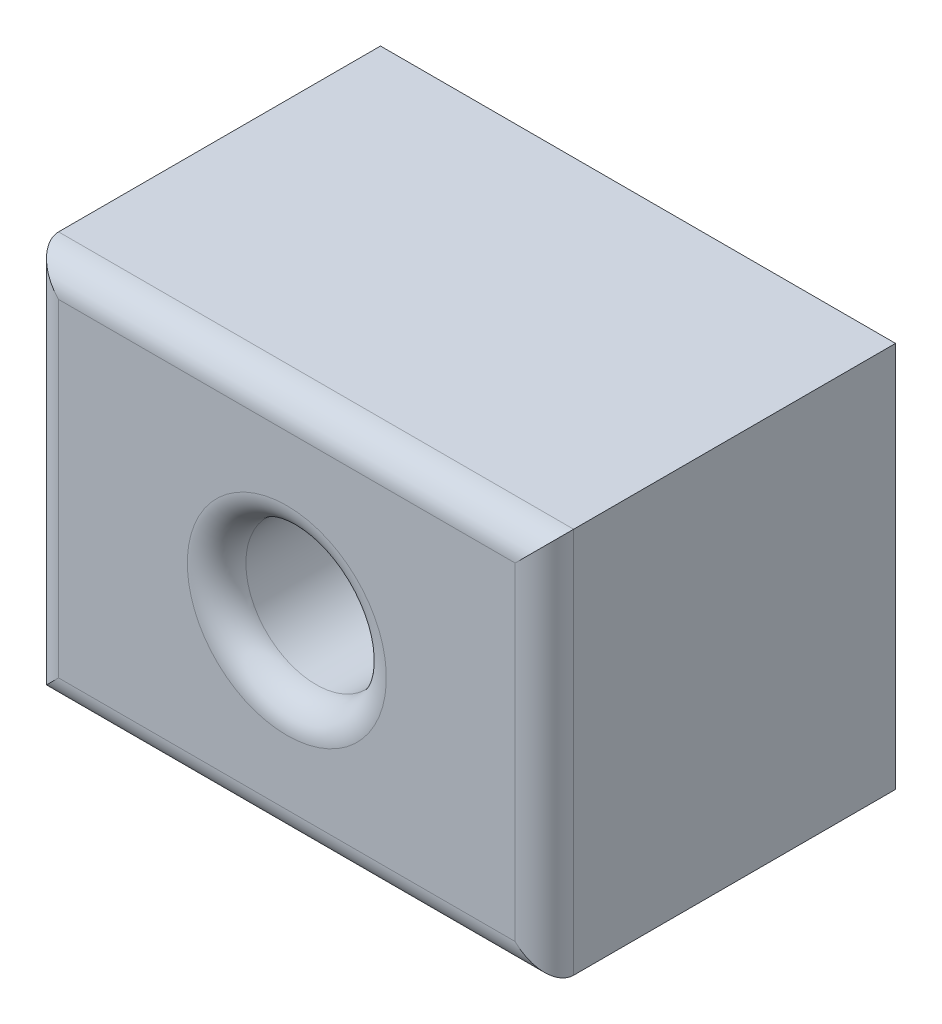
ISO-10303-21;
HEADER;
FILE_DESCRIPTION(('STEP AP214'),'2;1');
FILE_NAME('part.step','',(''),(''),'','','');
FILE_SCHEMA(('AUTOMOTIVE_DESIGN { 1 0 10303 214 1 1 1 1 }'));
ENDSEC;
DATA;
#1=APPLICATION_CONTEXT('core data for automotive mechanical design processes');
#2=APPLICATION_PROTOCOL_DEFINITION('international standard','automotive_design',2000,#1);
#3=PRODUCT_CONTEXT('',#1,'mechanical');
#4=PRODUCT('Part','Part','',(#3));
#5=PRODUCT_RELATED_PRODUCT_CATEGORY('part','',(#4));
#6=PRODUCT_DEFINITION_FORMATION('','',#4);
#7=PRODUCT_DEFINITION_CONTEXT('part definition',#1,'design');
#8=PRODUCT_DEFINITION('design','',#6,#7);
#9=PRODUCT_DEFINITION_SHAPE('','',#8);
#10=(LENGTH_UNIT() NAMED_UNIT(*) SI_UNIT(.MILLI.,.METRE.));
#11=(NAMED_UNIT(*) PLANE_ANGLE_UNIT() SI_UNIT($,.RADIAN.));
#12=(NAMED_UNIT(*) SI_UNIT($,.STERADIAN.) SOLID_ANGLE_UNIT());
#13=UNCERTAINTY_MEASURE_WITH_UNIT(LENGTH_MEASURE(1.E-05),#10,'distance_accuracy_value','');
#14=(GEOMETRIC_REPRESENTATION_CONTEXT(3) GLOBAL_UNCERTAINTY_ASSIGNED_CONTEXT((#13)) GLOBAL_UNIT_ASSIGNED_CONTEXT((#10,
#11,#12)) REPRESENTATION_CONTEXT('',''));
#15=CARTESIAN_POINT('',(0.,0.,0.));
#16=DIRECTION('',(0.,0.,1.));
#17=DIRECTION('',(1.,0.,0.));
#18=AXIS2_PLACEMENT_3D('',#15,#16,#17);
#19=CARTESIAN_POINT('',(9.57499999999997,67.085499818341,13.8275));
#20=DIRECTION('',(0.,0.,-1.));
#21=DIRECTION('',(-1.,0.,0.));
#22=AXIS2_PLACEMENT_3D('',#19,#20,#21);
#23=PLANE('',#22);
#24=CARTESIAN_POINT('',(9.57499999999997,67.085499818341,13.8275));
#25=DIRECTION('',(0.,0.,-1.));
#26=DIRECTION('',(-1.,0.,0.));
#27=AXIS2_PLACEMENT_3D('',#24,#25,#26);
#28=CIRCLE('',#27,1.47);
#29=CARTESIAN_POINT('',(8.10499999999997,67.085499818341,13.8275));
#30=VERTEX_POINT('',#29);
#31=EDGE_CURVE('E20',#30,#30,#28,.F.);
#32=ORIENTED_EDGE('',*,*,#31,.T.);
#33=EDGE_LOOP('',(#32));
#34=FACE_BOUND('',#33,.T.);
#35=CARTESIAN_POINT('',(9.57499999999997,67.085499818341,13.8275));
#36=DIRECTION('',(0.,0.,-1.));
#37=DIRECTION('',(-1.,0.,0.));
#38=AXIS2_PLACEMENT_3D('',#35,#36,#37);
#39=CIRCLE('',#38,2.695);
#40=CARTESIAN_POINT('',(6.87999999999997,67.085499818341,13.8275));
#41=VERTEX_POINT('',#40);
#42=EDGE_CURVE('E226',#41,#41,#39,.F.);
#43=ORIENTED_EDGE('',*,*,#42,.F.);
#44=EDGE_LOOP('',(#43));
#45=FACE_BOUND('',#44,.T.);
#46=ADVANCED_FACE('F17',(#34,#45),#23,.T.);
#47=CARTESIAN_POINT('',(9.57499999999997,67.085499818341,22.4025));
#48=DIRECTION('',(0.,0.,-1.));
#49=DIRECTION('',(-1.,0.,0.));
#50=AXIS2_PLACEMENT_3D('',#47,#48,#49);
#51=CYLINDRICAL_SURFACE('',#50,1.47);
#52=ORIENTED_EDGE('',*,*,#31,.F.);
#53=EDGE_LOOP('',(#52));
#54=FACE_BOUND('',#53,.T.);
#55=CARTESIAN_POINT('',(9.57499999999997,67.085499818341,15.665));
#56=DIRECTION('',(0.,0.,1.));
#57=DIRECTION('',(0.,1.,0.));
#58=AXIS2_PLACEMENT_3D('',#55,#56,#57);
#59=CIRCLE('',#58,1.47);
#60=CARTESIAN_POINT('',(9.57499999999997,68.555499818341,15.665));
#61=VERTEX_POINT('',#60);
#62=EDGE_CURVE('E223',#61,#61,#59,.F.);
#63=ORIENTED_EDGE('',*,*,#62,.F.);
#64=EDGE_LOOP('',(#63));
#65=FACE_BOUND('',#64,.T.);
#66=ADVANCED_FACE('F250',(#54,#65),#51,.F.);
#67=CARTESIAN_POINT('',(9.57499999999997,67.085499818341,16.2775));
#68=DIRECTION('',(0.,0.,-1.));
#69=DIRECTION('',(-1.,0.,0.));
#70=AXIS2_PLACEMENT_3D('',#67,#68,#69);
#71=CYLINDRICAL_SURFACE('',#70,2.695);
#72=CARTESIAN_POINT('',(9.57499999999997,67.085499818341,15.0525));
#73=DIRECTION('',(0.,0.,-1.));
#74=DIRECTION('',(-1.,0.,0.));
#75=AXIS2_PLACEMENT_3D('',#72,#73,#74);
#76=CIRCLE('',#75,2.695);
#77=CARTESIAN_POINT('',(6.87999999999997,67.085499818341,15.0525));
#78=VERTEX_POINT('',#77);
#79=EDGE_CURVE('E106',#78,#78,#76,.T.);
#80=ORIENTED_EDGE('',*,*,#79,.T.);
#81=EDGE_LOOP('',(#80));
#82=FACE_BOUND('',#81,.T.);
#83=ORIENTED_EDGE('',*,*,#42,.T.);
#84=EDGE_LOOP('',(#83));
#85=FACE_BOUND('',#84,.T.);
#86=ADVANCED_FACE('F218',(#82,#85),#71,.T.);
#87=CARTESIAN_POINT('',(9.57499999999997,67.085499818341,15.665));
#88=DIRECTION('',(0.,0.,1.));
#89=DIRECTION('',(0.,1.,0.));
#90=AXIS2_PLACEMENT_3D('',#87,#88,#89);
#91=TOROIDAL_SURFACE('',#90,2.0825,0.6125);
#92=ORIENTED_EDGE('',*,*,#62,.T.);
#93=EDGE_LOOP('',(#92));
#94=FACE_BOUND('',#93,.T.);
#95=CARTESIAN_POINT('',(9.57499999999997,67.085499818341,16.2775));
#96=DIRECTION('',(0.,0.,1.));
#97=DIRECTION('',(0.,1.,0.));
#98=AXIS2_PLACEMENT_3D('',#95,#96,#97);
#99=CIRCLE('',#98,2.08249999999999);
#100=CARTESIAN_POINT('',(9.57499999999997,69.167999818341,16.2775));
#101=VERTEX_POINT('',#100);
#102=EDGE_CURVE('E187',#101,#101,#99,.F.);
#103=ORIENTED_EDGE('',*,*,#102,.F.);
#104=EDGE_LOOP('',(#103));
#105=FACE_BOUND('',#104,.T.);
#106=ADVANCED_FACE('F212',(#94,#105),#91,.T.);
#107=CARTESIAN_POINT('',(9.57499999999997,61.376999818341,15.0525));
#108=DIRECTION('',(0.,0.,1.));
#109=DIRECTION('',(1.,0.,0.));
#110=AXIS2_PLACEMENT_3D('',#107,#108,#109);
#111=PLANE('',#110);
#112=ORIENTED_EDGE('',*,*,#79,.F.);
#113=EDGE_LOOP('',(#112));
#114=FACE_BOUND('',#113,.T.);
#115=DIRECTION('',(0.,1.,0.));
#116=VECTOR('',#115,1.);
#117=CARTESIAN_POINT('',(5.40999999999996,71.127999818341,15.0525));
#118=LINE('',#117,#116);
#119=CARTESIAN_POINT('',(5.40999999999996,64.2679998183409,15.0525));
#120=VERTEX_POINT('',#119);
#121=CARTESIAN_POINT('',(5.40999999999996,69.902999818341,15.0525));
#122=VERTEX_POINT('',#121);
#123=EDGE_CURVE('E160',#120,#122,#118,.T.);
#124=ORIENTED_EDGE('',*,*,#123,.T.);
#125=DIRECTION('',(1.,0.,0.));
#126=VECTOR('',#125,1.);
#127=CARTESIAN_POINT('',(14.965,69.902999818341,15.0525));
#128=LINE('',#127,#126);
#129=CARTESIAN_POINT('',(13.74,69.902999818341,15.0525));
#130=VERTEX_POINT('',#129);
#131=EDGE_CURVE('E178',#122,#130,#128,.T.);
#132=ORIENTED_EDGE('',*,*,#131,.T.);
#133=DIRECTION('',(0.,1.,0.));
#134=VECTOR('',#133,1.);
#135=CARTESIAN_POINT('',(13.74,63.0429998183409,15.0525));
#136=LINE('',#135,#134);
#137=CARTESIAN_POINT('',(13.74,64.2679998183409,15.0525));
#138=VERTEX_POINT('',#137);
#139=EDGE_CURVE('E173',#130,#138,#136,.F.);
#140=ORIENTED_EDGE('',*,*,#139,.T.);
#141=DIRECTION('',(1.,0.,0.));
#142=VECTOR('',#141,1.);
#143=CARTESIAN_POINT('',(4.18499999999997,64.2679998183409,15.0525));
#144=LINE('',#143,#142);
#145=EDGE_CURVE('E168',#138,#120,#144,.F.);
#146=ORIENTED_EDGE('',*,*,#145,.T.);
#147=EDGE_LOOP('',(#124,#132,#140,#146));
#148=FACE_BOUND('',#147,.T.);
#149=ADVANCED_FACE('F208',(#114,#148),#111,.F.);
#150=CARTESIAN_POINT('',(9.57499999999997,70.515499818341,15.665));
#151=DIRECTION('',(-1.,0.,0.));
#152=DIRECTION('',(0.,0.,1.));
#153=AXIS2_PLACEMENT_3D('',#150,#151,#152);
#154=CYLINDRICAL_SURFACE('',#153,0.6125);
#155=CARTESIAN_POINT('',(4.79749999999997,70.515499818341,15.665));
#156=DIRECTION('',(-0.707106781186547,-0.707106781186547,0.));
#157=DIRECTION('',(0.707106781186547,-0.707106781186547,0.));
#158=AXIS2_PLACEMENT_3D('',#155,#156,#157);
#159=ELLIPSE('',#158,0.866205806953521,0.6125);
#160=CARTESIAN_POINT('',(4.79749999999997,70.515499818341,16.2775));
#161=VERTEX_POINT('',#160);
#162=CARTESIAN_POINT('',(4.18499999999997,71.127999818341,15.665));
#163=VERTEX_POINT('',#162);
#164=EDGE_CURVE('E114',#161,#163,#159,.T.);
#165=ORIENTED_EDGE('',*,*,#164,.F.);
#166=DIRECTION('',(1.,0.,0.));
#167=VECTOR('',#166,1.);
#168=CARTESIAN_POINT('',(9.57499999999997,70.515499818341,16.2775));
#169=LINE('',#168,#167);
#170=CARTESIAN_POINT('',(14.3525,70.515499818341,16.2775));
#171=VERTEX_POINT('',#170);
#172=EDGE_CURVE('E115',#171,#161,#169,.F.);
#173=ORIENTED_EDGE('',*,*,#172,.F.);
#174=CARTESIAN_POINT('',(14.3525,70.515499818341,15.665));
#175=DIRECTION('',(-0.707106781186547,0.707106781186547,0.));
#176=DIRECTION('',(0.707106781186547,0.707106781186547,0.));
#177=AXIS2_PLACEMENT_3D('',#174,#175,#176);
#178=ELLIPSE('',#177,0.866205806953521,0.6125);
#179=CARTESIAN_POINT('',(14.965,71.127999818341,15.665));
#180=VERTEX_POINT('',#179);
#181=EDGE_CURVE('E105',#180,#171,#178,.F.);
#182=ORIENTED_EDGE('',*,*,#181,.F.);
#183=DIRECTION('',(1.,0.,0.));
#184=VECTOR('',#183,1.);
#185=CARTESIAN_POINT('',(14.965,71.127999818341,15.665));
#186=LINE('',#185,#184);
#187=EDGE_CURVE('E154',#163,#180,#186,.T.);
#188=ORIENTED_EDGE('',*,*,#187,.F.);
#189=EDGE_LOOP('',(#165,#173,#182,#188));
#190=FACE_BOUND('',#189,.T.);
#191=ADVANCED_FACE('F205',(#190),#154,.T.);
#192=CARTESIAN_POINT('',(14.3525,61.376999818341,15.665));
#193=DIRECTION('',(0.,1.,0.));
#194=DIRECTION('',(0.,0.,1.));
#195=AXIS2_PLACEMENT_3D('',#192,#193,#194);
#196=CYLINDRICAL_SURFACE('',#195,0.6125);
#197=ORIENTED_EDGE('',*,*,#181,.T.);
#198=DIRECTION('',(0.,1.,0.));
#199=VECTOR('',#198,1.);
#200=CARTESIAN_POINT('',(14.3525,61.376999818341,16.2775));
#201=LINE('',#200,#199);
#202=CARTESIAN_POINT('',(14.3525,63.6554998183409,16.2775));
#203=VERTEX_POINT('',#202);
#204=EDGE_CURVE('E110',#203,#171,#201,.T.);
#205=ORIENTED_EDGE('',*,*,#204,.F.);
#206=CARTESIAN_POINT('',(14.3525,63.6554998183409,15.665));
#207=DIRECTION('',(0.707106781186547,0.707106781186547,0.));
#208=DIRECTION('',(-0.707106781186547,0.707106781186547,0.));
#209=AXIS2_PLACEMENT_3D('',#206,#207,#208);
#210=ELLIPSE('',#209,0.866205806953521,0.6125);
#211=CARTESIAN_POINT('',(14.965,63.0429998183409,15.665));
#212=VERTEX_POINT('',#211);
#213=EDGE_CURVE('E93',#203,#212,#210,.T.);
#214=ORIENTED_EDGE('',*,*,#213,.T.);
#215=DIRECTION('',(0.,1.,0.));
#216=VECTOR('',#215,1.);
#217=CARTESIAN_POINT('',(14.965,63.0429998183409,15.665));
#218=LINE('',#217,#216);
#219=EDGE_CURVE('E123',#180,#212,#218,.F.);
#220=ORIENTED_EDGE('',*,*,#219,.F.);
#221=EDGE_LOOP('',(#197,#205,#214,#220));
#222=FACE_BOUND('',#221,.T.);
#223=ADVANCED_FACE('F111',(#222),#196,.T.);
#224=CARTESIAN_POINT('',(9.57499999999997,61.376999818341,16.2775));
#225=DIRECTION('',(0.,0.,1.));
#226=DIRECTION('',(1.,0.,0.));
#227=AXIS2_PLACEMENT_3D('',#224,#225,#226);
#228=PLANE('',#227);
#229=DIRECTION('',(1.,0.,0.));
#230=VECTOR('',#229,1.);
#231=CARTESIAN_POINT('',(9.57499999999997,63.6554998183409,16.2775));
#232=LINE('',#231,#230);
#233=CARTESIAN_POINT('',(4.79749999999997,63.6554998183409,16.2775));
#234=VERTEX_POINT('',#233);
#235=EDGE_CURVE('E98',#203,#234,#232,.F.);
#236=ORIENTED_EDGE('',*,*,#235,.F.);
#237=ORIENTED_EDGE('',*,*,#204,.T.);
#238=ORIENTED_EDGE('',*,*,#172,.T.);
#239=DIRECTION('',(0.,-1.,0.));
#240=VECTOR('',#239,1.);
#241=CARTESIAN_POINT('',(4.79749999999997,61.376999818341,16.2775));
#242=LINE('',#241,#240);
#243=EDGE_CURVE('E120',#234,#161,#242,.F.);
#244=ORIENTED_EDGE('',*,*,#243,.F.);
#245=EDGE_LOOP('',(#236,#237,#238,#244));
#246=FACE_BOUND('',#245,.T.);
#247=ORIENTED_EDGE('',*,*,#102,.T.);
#248=EDGE_LOOP('',(#247));
#249=FACE_BOUND('',#248,.T.);
#250=ADVANCED_FACE('F117',(#246,#249),#228,.T.);
#251=CARTESIAN_POINT('',(4.79749999999997,61.376999818341,15.665));
#252=DIRECTION('',(0.,-1.,0.));
#253=DIRECTION('',(0.,0.,-1.));
#254=AXIS2_PLACEMENT_3D('',#251,#252,#253);
#255=CYLINDRICAL_SURFACE('',#254,0.6125);
#256=CARTESIAN_POINT('',(4.79749999999997,63.6554998183409,15.665));
#257=DIRECTION('',(0.707106781186547,-0.707106781186547,0.));
#258=DIRECTION('',(0.707106781186547,0.707106781186547,0.));
#259=AXIS2_PLACEMENT_3D('',#256,#257,#258);
#260=ELLIPSE('',#259,0.866205806953521,0.6125);
#261=CARTESIAN_POINT('',(4.18499999999997,63.0429998183409,15.665));
#262=VERTEX_POINT('',#261);
#263=EDGE_CURVE('E122',#234,#262,#260,.T.);
#264=ORIENTED_EDGE('',*,*,#263,.F.);
#265=ORIENTED_EDGE('',*,*,#243,.T.);
#266=ORIENTED_EDGE('',*,*,#164,.T.);
#267=DIRECTION('',(0.,1.,0.));
#268=VECTOR('',#267,1.);
#269=CARTESIAN_POINT('',(4.18499999999997,71.127999818341,15.665));
#270=LINE('',#269,#268);
#271=EDGE_CURVE('E125',#262,#163,#270,.T.);
#272=ORIENTED_EDGE('',*,*,#271,.F.);
#273=EDGE_LOOP('',(#264,#265,#266,#272));
#274=FACE_BOUND('',#273,.T.);
#275=ADVANCED_FACE('F201',(#274),#255,.T.);
#276=CARTESIAN_POINT('',(14.965,69.902999818341,8.9275));
#277=DIRECTION('',(0.,1.,0.));
#278=DIRECTION('',(0.,0.,1.));
#279=AXIS2_PLACEMENT_3D('',#276,#277,#278);
#280=PLANE('',#279);
#281=DIRECTION('',(0.,0.,1.));
#282=VECTOR('',#281,1.);
#283=CARTESIAN_POINT('',(5.40999999999996,69.902999818341,8.9275));
#284=LINE('',#283,#282);
#285=CARTESIAN_POINT('',(5.40999999999996,69.902999818341,8.9275));
#286=VERTEX_POINT('',#285);
#287=EDGE_CURVE('E166',#122,#286,#284,.F.);
#288=ORIENTED_EDGE('',*,*,#287,.T.);
#289=DIRECTION('',(1.,0.,0.));
#290=VECTOR('',#289,1.);
#291=CARTESIAN_POINT('',(9.57499999999997,69.902999818341,8.9275));
#292=LINE('',#291,#290);
#293=CARTESIAN_POINT('',(13.74,69.902999818341,8.9275));
#294=VERTEX_POINT('',#293);
#295=EDGE_CURVE('E131',#286,#294,#292,.T.);
#296=ORIENTED_EDGE('',*,*,#295,.T.);
#297=DIRECTION('',(0.,0.,-1.));
#298=VECTOR('',#297,1.);
#299=CARTESIAN_POINT('',(13.74,69.902999818341,8.9275));
#300=LINE('',#299,#298);
#301=EDGE_CURVE('E175',#294,#130,#300,.F.);
#302=ORIENTED_EDGE('',*,*,#301,.T.);
#303=ORIENTED_EDGE('',*,*,#131,.F.);
#304=EDGE_LOOP('',(#288,#296,#302,#303));
#305=FACE_BOUND('',#304,.T.);
#306=ADVANCED_FACE('F294',(#305),#280,.F.);
#307=CARTESIAN_POINT('',(13.74,63.0429998183409,8.9275));
#308=DIRECTION('',(1.,0.,0.));
#309=DIRECTION('',(0.,0.,-1.));
#310=AXIS2_PLACEMENT_3D('',#307,#308,#309);
#311=PLANE('',#310);
#312=ORIENTED_EDGE('',*,*,#301,.F.);
#313=DIRECTION('',(0.,1.,0.));
#314=VECTOR('',#313,1.);
#315=CARTESIAN_POINT('',(13.74,61.376999818341,8.9275));
#316=LINE('',#315,#314);
#317=CARTESIAN_POINT('',(13.74,64.2679998183409,8.9275));
#318=VERTEX_POINT('',#317);
#319=EDGE_CURVE('E314',#294,#318,#316,.F.);
#320=ORIENTED_EDGE('',*,*,#319,.T.);
#321=DIRECTION('',(0.,0.,-1.));
#322=VECTOR('',#321,1.);
#323=CARTESIAN_POINT('',(13.74,64.2679998183409,8.9275));
#324=LINE('',#323,#322);
#325=EDGE_CURVE('E170',#318,#138,#324,.F.);
#326=ORIENTED_EDGE('',*,*,#325,.T.);
#327=ORIENTED_EDGE('',*,*,#139,.F.);
#328=EDGE_LOOP('',(#312,#320,#326,#327));
#329=FACE_BOUND('',#328,.T.);
#330=ADVANCED_FACE('F291',(#329),#311,.F.);
#331=CARTESIAN_POINT('',(4.18499999999997,64.2679998183409,8.9275));
#332=DIRECTION('',(0.,-1.,0.));
#333=DIRECTION('',(0.,0.,-1.));
#334=AXIS2_PLACEMENT_3D('',#331,#332,#333);
#335=PLANE('',#334);
#336=ORIENTED_EDGE('',*,*,#325,.F.);
#337=DIRECTION('',(1.,0.,0.));
#338=VECTOR('',#337,1.);
#339=CARTESIAN_POINT('',(9.57499999999997,64.2679998183409,8.9275));
#340=LINE('',#339,#338);
#341=CARTESIAN_POINT('',(5.40999999999996,64.2679998183409,8.9275));
#342=VERTEX_POINT('',#341);
#343=EDGE_CURVE('E311',#318,#342,#340,.F.);
#344=ORIENTED_EDGE('',*,*,#343,.T.);
#345=DIRECTION('',(0.,0.,1.));
#346=VECTOR('',#345,1.);
#347=CARTESIAN_POINT('',(5.40999999999996,64.2679998183409,8.9275));
#348=LINE('',#347,#346);
#349=EDGE_CURVE('E163',#342,#120,#348,.T.);
#350=ORIENTED_EDGE('',*,*,#349,.T.);
#351=ORIENTED_EDGE('',*,*,#145,.F.);
#352=EDGE_LOOP('',(#336,#344,#350,#351));
#353=FACE_BOUND('',#352,.T.);
#354=ADVANCED_FACE('F287',(#353),#335,.F.);
#355=CARTESIAN_POINT('',(5.40999999999996,71.127999818341,8.9275));
#356=DIRECTION('',(-1.,0.,0.));
#357=DIRECTION('',(0.,0.,1.));
#358=AXIS2_PLACEMENT_3D('',#355,#356,#357);
#359=PLANE('',#358);
#360=ORIENTED_EDGE('',*,*,#349,.F.);
#361=DIRECTION('',(0.,1.,0.));
#362=VECTOR('',#361,1.);
#363=CARTESIAN_POINT('',(5.40999999999996,61.376999818341,8.9275));
#364=LINE('',#363,#362);
#365=EDGE_CURVE('E147',#342,#286,#364,.T.);
#366=ORIENTED_EDGE('',*,*,#365,.T.);
#367=ORIENTED_EDGE('',*,*,#287,.F.);
#368=ORIENTED_EDGE('',*,*,#123,.F.);
#369=EDGE_LOOP('',(#360,#366,#367,#368));
#370=FACE_BOUND('',#369,.T.);
#371=ADVANCED_FACE('F283',(#370),#359,.F.);
#372=CARTESIAN_POINT('',(14.965,71.127999818341,8.9275));
#373=DIRECTION('',(0.,1.,0.));
#374=DIRECTION('',(0.,0.,1.));
#375=AXIS2_PLACEMENT_3D('',#372,#373,#374);
#376=PLANE('',#375);
#377=DIRECTION('',(0.,0.,-1.));
#378=VECTOR('',#377,1.);
#379=CARTESIAN_POINT('',(14.965,71.127999818341,8.9275));
#380=LINE('',#379,#378);
#381=CARTESIAN_POINT('',(14.965,71.127999818341,8.9275));
#382=VERTEX_POINT('',#381);
#383=EDGE_CURVE('E127',#382,#180,#380,.F.);
#384=ORIENTED_EDGE('',*,*,#383,.F.);
#385=DIRECTION('',(1.,0.,0.));
#386=VECTOR('',#385,1.);
#387=CARTESIAN_POINT('',(9.57499999999997,71.127999818341,8.9275));
#388=LINE('',#387,#386);
#389=CARTESIAN_POINT('',(4.18499999999997,71.127999818341,8.9275));
#390=VERTEX_POINT('',#389);
#391=EDGE_CURVE('E146',#382,#390,#388,.F.);
#392=ORIENTED_EDGE('',*,*,#391,.T.);
#393=DIRECTION('',(0.,0.,1.));
#394=VECTOR('',#393,1.);
#395=CARTESIAN_POINT('',(4.18499999999997,71.127999818341,8.9275));
#396=LINE('',#395,#394);
#397=EDGE_CURVE('E141',#163,#390,#396,.F.);
#398=ORIENTED_EDGE('',*,*,#397,.F.);
#399=ORIENTED_EDGE('',*,*,#187,.T.);
#400=EDGE_LOOP('',(#384,#392,#398,#399));
#401=FACE_BOUND('',#400,.T.);
#402=ADVANCED_FACE('F279',(#401),#376,.T.);
#403=CARTESIAN_POINT('',(14.965,63.0429998183409,8.9275));
#404=DIRECTION('',(1.,0.,0.));
#405=DIRECTION('',(0.,0.,-1.));
#406=AXIS2_PLACEMENT_3D('',#403,#404,#405);
#407=PLANE('',#406);
#408=DIRECTION('',(0.,0.,-1.));
#409=VECTOR('',#408,1.);
#410=CARTESIAN_POINT('',(14.965,63.0429998183409,8.9275));
#411=LINE('',#410,#409);
#412=CARTESIAN_POINT('',(14.965,63.0429998183409,8.9275));
#413=VERTEX_POINT('',#412);
#414=EDGE_CURVE('E133',#413,#212,#411,.F.);
#415=ORIENTED_EDGE('',*,*,#414,.F.);
#416=DIRECTION('',(0.,1.,0.));
#417=VECTOR('',#416,1.);
#418=CARTESIAN_POINT('',(14.965,61.376999818341,8.9275));
#419=LINE('',#418,#417);
#420=EDGE_CURVE('E143',#413,#382,#419,.T.);
#421=ORIENTED_EDGE('',*,*,#420,.T.);
#422=ORIENTED_EDGE('',*,*,#383,.T.);
#423=ORIENTED_EDGE('',*,*,#219,.T.);
#424=EDGE_LOOP('',(#415,#421,#422,#423));
#425=FACE_BOUND('',#424,.T.);
#426=ADVANCED_FACE('F276',(#425),#407,.T.);
#427=CARTESIAN_POINT('',(9.57499999999997,63.6554998183409,15.665));
#428=DIRECTION('',(1.,0.,0.));
#429=DIRECTION('',(0.,0.,-1.));
#430=AXIS2_PLACEMENT_3D('',#427,#428,#429);
#431=CYLINDRICAL_SURFACE('',#430,0.6125);
#432=ORIENTED_EDGE('',*,*,#263,.T.);
#433=DIRECTION('',(1.,0.,0.));
#434=VECTOR('',#433,1.);
#435=CARTESIAN_POINT('',(4.18499999999997,63.0429998183409,15.665));
#436=LINE('',#435,#434);
#437=EDGE_CURVE('E100',#212,#262,#436,.F.);
#438=ORIENTED_EDGE('',*,*,#437,.F.);
#439=ORIENTED_EDGE('',*,*,#213,.F.);
#440=ORIENTED_EDGE('',*,*,#235,.T.);
#441=EDGE_LOOP('',(#432,#438,#439,#440));
#442=FACE_BOUND('',#441,.T.);
#443=ADVANCED_FACE('F96',(#442),#431,.T.);
#444=CARTESIAN_POINT('',(4.18499999999997,71.127999818341,8.9275));
#445=DIRECTION('',(-1.,0.,0.));
#446=DIRECTION('',(0.,0.,1.));
#447=AXIS2_PLACEMENT_3D('',#444,#445,#446);
#448=PLANE('',#447);
#449=ORIENTED_EDGE('',*,*,#397,.T.);
#450=DIRECTION('',(0.,1.,0.));
#451=VECTOR('',#450,1.);
#452=CARTESIAN_POINT('',(4.18499999999997,61.376999818341,8.9275));
#453=LINE('',#452,#451);
#454=CARTESIAN_POINT('',(4.18499999999997,63.0429998183409,8.9275));
#455=VERTEX_POINT('',#454);
#456=EDGE_CURVE('E35',#390,#455,#453,.F.);
#457=ORIENTED_EDGE('',*,*,#456,.T.);
#458=DIRECTION('',(0.,0.,-1.));
#459=VECTOR('',#458,1.);
#460=CARTESIAN_POINT('',(4.18499999999997,63.0429998183409,8.9275));
#461=LINE('',#460,#459);
#462=EDGE_CURVE('E26',#262,#455,#461,.T.);
#463=ORIENTED_EDGE('',*,*,#462,.F.);
#464=ORIENTED_EDGE('',*,*,#271,.T.);
#465=EDGE_LOOP('',(#449,#457,#463,#464));
#466=FACE_BOUND('',#465,.T.);
#467=ADVANCED_FACE('F268',(#466),#448,.T.);
#468=CARTESIAN_POINT('',(9.57499999999997,61.376999818341,8.9275));
#469=DIRECTION('',(0.,0.,1.));
#470=DIRECTION('',(1.,0.,0.));
#471=AXIS2_PLACEMENT_3D('',#468,#469,#470);
#472=PLANE('',#471);
#473=ORIENTED_EDGE('',*,*,#456,.F.);
#474=ORIENTED_EDGE('',*,*,#391,.F.);
#475=ORIENTED_EDGE('',*,*,#420,.F.);
#476=DIRECTION('',(1.,0.,0.));
#477=VECTOR('',#476,1.);
#478=CARTESIAN_POINT('',(4.18499999999997,63.0429998183409,8.9275));
#479=LINE('',#478,#477);
#480=EDGE_CURVE('E11',#455,#413,#479,.T.);
#481=ORIENTED_EDGE('',*,*,#480,.F.);
#482=EDGE_LOOP('',(#473,#474,#475,#481));
#483=FACE_BOUND('',#482,.T.);
#484=ORIENTED_EDGE('',*,*,#343,.F.);
#485=ORIENTED_EDGE('',*,*,#319,.F.);
#486=ORIENTED_EDGE('',*,*,#295,.F.);
#487=ORIENTED_EDGE('',*,*,#365,.F.);
#488=EDGE_LOOP('',(#484,#485,#486,#487));
#489=FACE_BOUND('',#488,.T.);
#490=ADVANCED_FACE('F262',(#483,#489),#472,.F.);
#491=CARTESIAN_POINT('',(4.18499999999997,63.0429998183409,8.9275));
#492=DIRECTION('',(0.,-1.,0.));
#493=DIRECTION('',(0.,0.,-1.));
#494=AXIS2_PLACEMENT_3D('',#491,#492,#493);
#495=PLANE('',#494);
#496=ORIENTED_EDGE('',*,*,#462,.T.);
#497=ORIENTED_EDGE('',*,*,#480,.T.);
#498=ORIENTED_EDGE('',*,*,#414,.T.);
#499=ORIENTED_EDGE('',*,*,#437,.T.);
#500=EDGE_LOOP('',(#496,#497,#498,#499));
#501=FACE_BOUND('',#500,.T.);
#502=ADVANCED_FACE('F260',(#501),#495,.T.);
#503=CLOSED_SHELL('',(#46,#66,#86,#106,#149,#191,#223,#250,#275,#306,#330,#354,#371,#402,#426,
#443,#467,#490,#502));
#504=MANIFOLD_SOLID_BREP('B1',#503);
#505=ADVANCED_BREP_SHAPE_REPRESENTATION('',(#18,#504),#14);
#506=SHAPE_DEFINITION_REPRESENTATION(#9,#505);
ENDSEC;
END-ISO-10303-21;
